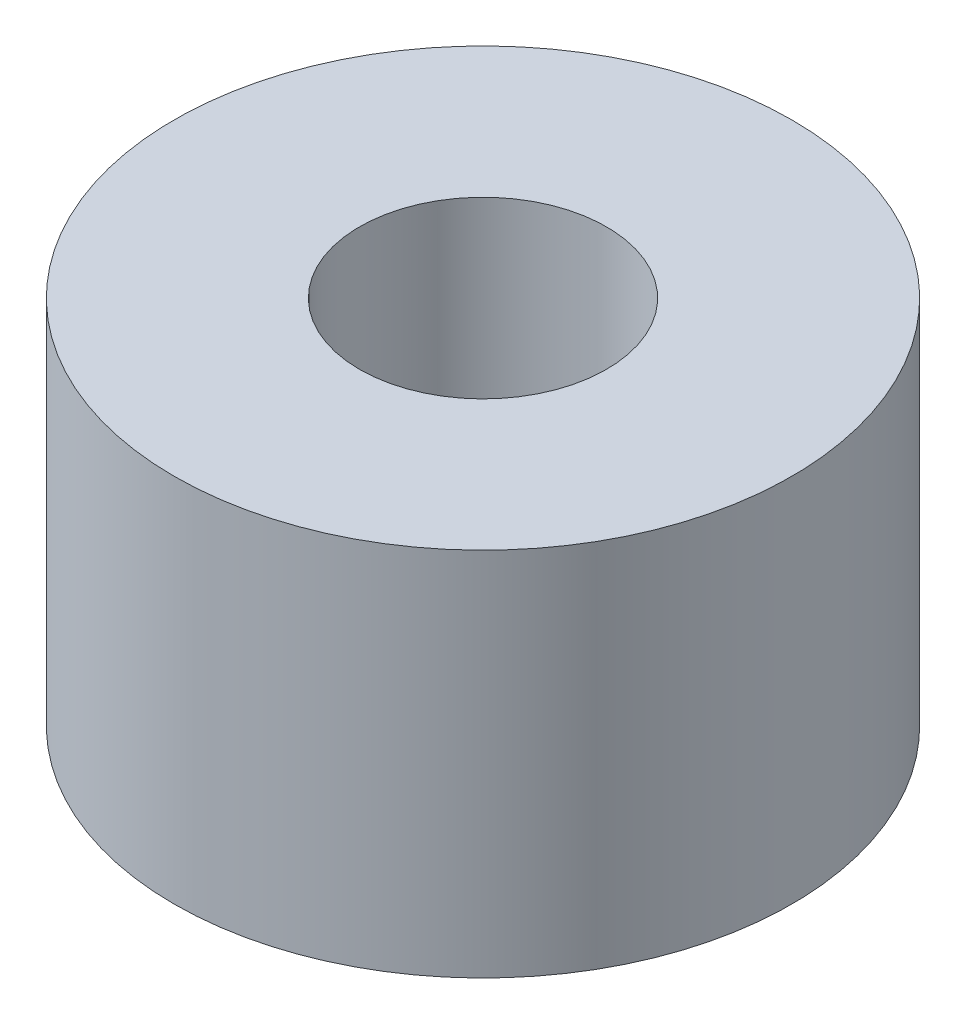
ISO-10303-21;
HEADER;
FILE_DESCRIPTION(('STEP AP214'),'2;1');
FILE_NAME('part.step','',(''),(''),'','','');
FILE_SCHEMA(('AUTOMOTIVE_DESIGN { 1 0 10303 214 1 1 1 1 }'));
ENDSEC;
DATA;
#1=APPLICATION_CONTEXT('core data for automotive mechanical design processes');
#2=APPLICATION_PROTOCOL_DEFINITION('international standard','automotive_design',2000,#1);
#3=PRODUCT_CONTEXT('',#1,'mechanical');
#4=PRODUCT('Part','Part','',(#3));
#5=PRODUCT_RELATED_PRODUCT_CATEGORY('part','',(#4));
#6=PRODUCT_DEFINITION_FORMATION('','',#4);
#7=PRODUCT_DEFINITION_CONTEXT('part definition',#1,'design');
#8=PRODUCT_DEFINITION('design','',#6,#7);
#9=PRODUCT_DEFINITION_SHAPE('','',#8);
#10=(LENGTH_UNIT() NAMED_UNIT(*) SI_UNIT(.MILLI.,.METRE.));
#11=(NAMED_UNIT(*) PLANE_ANGLE_UNIT() SI_UNIT($,.RADIAN.));
#12=(NAMED_UNIT(*) SI_UNIT($,.STERADIAN.) SOLID_ANGLE_UNIT());
#13=UNCERTAINTY_MEASURE_WITH_UNIT(LENGTH_MEASURE(1.E-05),#10,'distance_accuracy_value','');
#14=(GEOMETRIC_REPRESENTATION_CONTEXT(3) GLOBAL_UNCERTAINTY_ASSIGNED_CONTEXT((#13)) GLOBAL_UNIT_ASSIGNED_CONTEXT((#10,
#11,#12)) REPRESENTATION_CONTEXT('',''));
#15=CARTESIAN_POINT('',(0.,0.,0.));
#16=DIRECTION('',(0.,0.,1.));
#17=DIRECTION('',(1.,0.,0.));
#18=AXIS2_PLACEMENT_3D('',#15,#16,#17);
#19=CARTESIAN_POINT('',(5.25,10.,0.));
#20=DIRECTION('',(0.,-1.,0.));
#21=DIRECTION('',(0.,0.,-1.));
#22=AXIS2_PLACEMENT_3D('',#19,#20,#21);
#23=PLANE('',#22);
#24=CARTESIAN_POINT('',(0.,10.,0.));
#25=DIRECTION('',(0.,1.,0.));
#26=DIRECTION('',(0.,0.,1.));
#27=AXIS2_PLACEMENT_3D('',#24,#25,#26);
#28=CIRCLE('',#27,10.);
#29=CARTESIAN_POINT('',(0.,10.,10.));
#30=VERTEX_POINT('',#29);
#31=EDGE_CURVE('E18',#30,#30,#28,.T.);
#32=ORIENTED_EDGE('',*,*,#31,.T.);
#33=EDGE_LOOP('',(#32));
#34=FACE_BOUND('',#33,.T.);
#35=CARTESIAN_POINT('',(0.,10.,0.));
#36=DIRECTION('',(0.,1.,0.));
#37=DIRECTION('',(0.,0.,1.));
#38=AXIS2_PLACEMENT_3D('',#35,#36,#37);
#39=CIRCLE('',#38,5.25);
#40=CARTESIAN_POINT('',(0.,10.,5.25));
#41=VERTEX_POINT('',#40);
#42=EDGE_CURVE('E34',#41,#41,#39,.F.);
#43=ORIENTED_EDGE('',*,*,#42,.T.);
#44=EDGE_LOOP('',(#43));
#45=FACE_BOUND('',#44,.T.);
#46=ADVANCED_FACE('F15',(#34,#45),#23,.F.);
#47=CARTESIAN_POINT('',(0.,30.,0.));
#48=DIRECTION('',(0.,1.,0.));
#49=DIRECTION('',(0.,0.,1.));
#50=AXIS2_PLACEMENT_3D('',#47,#48,#49);
#51=CYLINDRICAL_SURFACE('',#50,10.);
#52=CARTESIAN_POINT('',(0.,30.,0.));
#53=DIRECTION('',(0.,1.,0.));
#54=DIRECTION('',(0.,0.,1.));
#55=AXIS2_PLACEMENT_3D('',#52,#53,#54);
#56=CIRCLE('',#55,10.);
#57=CARTESIAN_POINT('',(0.,30.,10.));
#58=VERTEX_POINT('',#57);
#59=EDGE_CURVE('E32',#58,#58,#56,.F.);
#60=ORIENTED_EDGE('',*,*,#59,.F.);
#61=EDGE_LOOP('',(#60));
#62=FACE_BOUND('',#61,.T.);
#63=ORIENTED_EDGE('',*,*,#31,.F.);
#64=EDGE_LOOP('',(#63));
#65=FACE_BOUND('',#64,.T.);
#66=ADVANCED_FACE('F42',(#62,#65),#51,.F.);
#67=CARTESIAN_POINT('',(0.,30.,0.));
#68=DIRECTION('',(0.,1.,0.));
#69=DIRECTION('',(0.,0.,1.));
#70=AXIS2_PLACEMENT_3D('',#67,#68,#69);
#71=CYLINDRICAL_SURFACE('',#70,5.25);
#72=CARTESIAN_POINT('',(0.,0.,0.));
#73=DIRECTION('',(0.,1.,0.));
#74=DIRECTION('',(0.,0.,1.));
#75=AXIS2_PLACEMENT_3D('',#72,#73,#74);
#76=CIRCLE('',#75,5.25);
#77=CARTESIAN_POINT('',(0.,0.,5.25));
#78=VERTEX_POINT('',#77);
#79=EDGE_CURVE('E27',#78,#78,#76,.F.);
#80=ORIENTED_EDGE('',*,*,#79,.T.);
#81=EDGE_LOOP('',(#80));
#82=FACE_BOUND('',#81,.T.);
#83=ORIENTED_EDGE('',*,*,#42,.F.);
#84=EDGE_LOOP('',(#83));
#85=FACE_BOUND('',#84,.T.);
#86=ADVANCED_FACE('F44',(#82,#85),#71,.F.);
#87=CARTESIAN_POINT('',(0.,30.,0.));
#88=DIRECTION('',(0.,1.,0.));
#89=DIRECTION('',(0.,0.,1.));
#90=AXIS2_PLACEMENT_3D('',#87,#88,#89);
#91=PLANE('',#90);
#92=CARTESIAN_POINT('',(0.,30.,0.));
#93=DIRECTION('',(0.,-1.,0.));
#94=DIRECTION('',(0.,0.,-1.));
#95=AXIS2_PLACEMENT_3D('',#92,#93,#94);
#96=CIRCLE('',#95,25.);
#97=CARTESIAN_POINT('',(0.,30.,-25.));
#98=VERTEX_POINT('',#97);
#99=EDGE_CURVE('E22',#98,#98,#96,.T.);
#100=ORIENTED_EDGE('',*,*,#99,.F.);
#101=EDGE_LOOP('',(#100));
#102=FACE_BOUND('',#101,.T.);
#103=ORIENTED_EDGE('',*,*,#59,.T.);
#104=EDGE_LOOP('',(#103));
#105=FACE_BOUND('',#104,.T.);
#106=ADVANCED_FACE('F52',(#102,#105),#91,.T.);
#107=CARTESIAN_POINT('',(0.,0.,0.));
#108=DIRECTION('',(0.,1.,0.));
#109=DIRECTION('',(0.,0.,1.));
#110=AXIS2_PLACEMENT_3D('',#107,#108,#109);
#111=PLANE('',#110);
#112=CARTESIAN_POINT('',(0.,0.,0.));
#113=DIRECTION('',(0.,-1.,0.));
#114=DIRECTION('',(0.,0.,-1.));
#115=AXIS2_PLACEMENT_3D('',#112,#113,#114);
#116=CIRCLE('',#115,25.);
#117=CARTESIAN_POINT('',(0.,0.,-25.));
#118=VERTEX_POINT('',#117);
#119=EDGE_CURVE('E10',#118,#118,#116,.F.);
#120=ORIENTED_EDGE('',*,*,#119,.F.);
#121=EDGE_LOOP('',(#120));
#122=FACE_BOUND('',#121,.T.);
#123=ORIENTED_EDGE('',*,*,#79,.F.);
#124=EDGE_LOOP('',(#123));
#125=FACE_BOUND('',#124,.T.);
#126=ADVANCED_FACE('F58',(#122,#125),#111,.F.);
#127=CARTESIAN_POINT('',(0.,30.,0.));
#128=DIRECTION('',(0.,-1.,0.));
#129=DIRECTION('',(0.,0.,-1.));
#130=AXIS2_PLACEMENT_3D('',#127,#128,#129);
#131=CYLINDRICAL_SURFACE('',#130,25.);
#132=ORIENTED_EDGE('',*,*,#119,.T.);
#133=EDGE_LOOP('',(#132));
#134=FACE_BOUND('',#133,.T.);
#135=ORIENTED_EDGE('',*,*,#99,.T.);
#136=EDGE_LOOP('',(#135));
#137=FACE_BOUND('',#136,.T.);
#138=ADVANCED_FACE('F56',(#134,#137),#131,.T.);
#139=CLOSED_SHELL('',(#46,#66,#86,#106,#126,#138));
#140=MANIFOLD_SOLID_BREP('B1',#139);
#141=ADVANCED_BREP_SHAPE_REPRESENTATION('',(#18,#140),#14);
#142=SHAPE_DEFINITION_REPRESENTATION(#9,#141);
ENDSEC;
END-ISO-10303-21;
